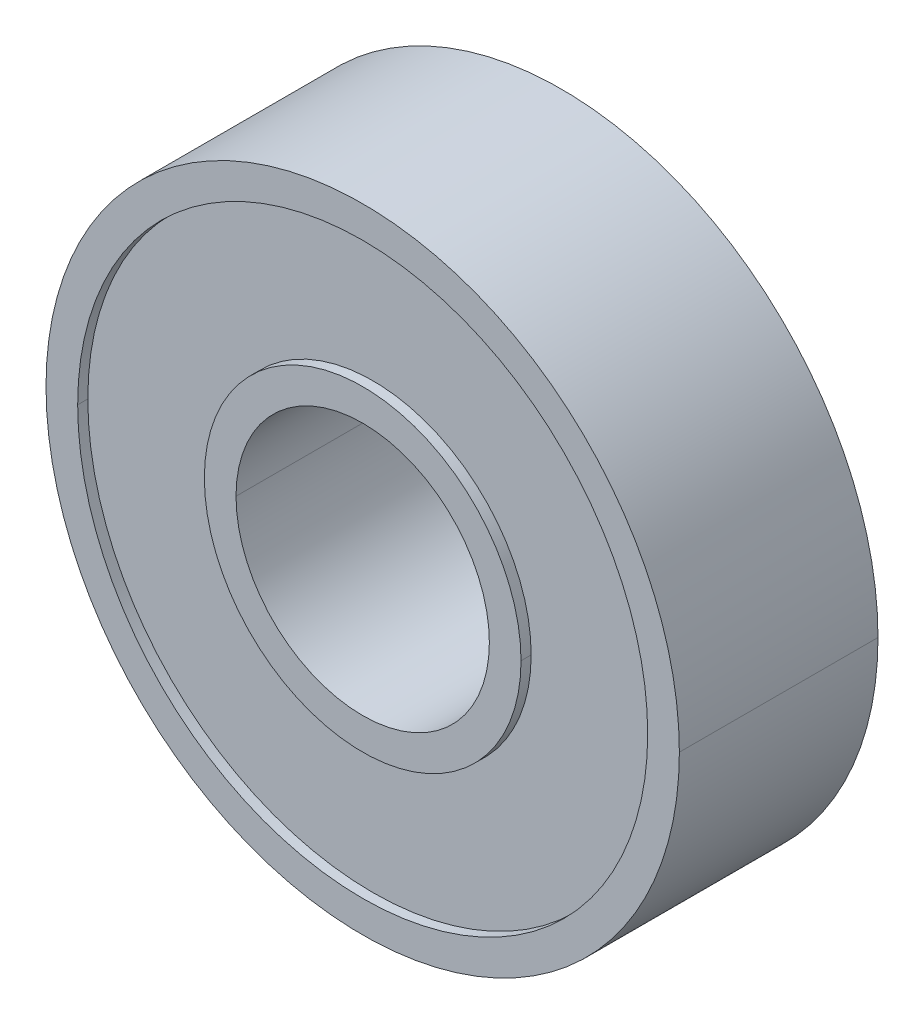
ISO-10303-21;
HEADER;
FILE_DESCRIPTION(('STEP AP214'),'2;1');
FILE_NAME('part.step','',(''),(''),'','','');
FILE_SCHEMA(('AUTOMOTIVE_DESIGN { 1 0 10303 214 1 1 1 1 }'));
ENDSEC;
DATA;
#1=APPLICATION_CONTEXT('core data for automotive mechanical design processes');
#2=APPLICATION_PROTOCOL_DEFINITION('international standard','automotive_design',2000,#1);
#3=PRODUCT_CONTEXT('',#1,'mechanical');
#4=PRODUCT('Part','Part','',(#3));
#5=PRODUCT_RELATED_PRODUCT_CATEGORY('part','',(#4));
#6=PRODUCT_DEFINITION_FORMATION('','',#4);
#7=PRODUCT_DEFINITION_CONTEXT('part definition',#1,'design');
#8=PRODUCT_DEFINITION('design','',#6,#7);
#9=PRODUCT_DEFINITION_SHAPE('','',#8);
#10=(LENGTH_UNIT() NAMED_UNIT(*) SI_UNIT(.MILLI.,.METRE.));
#11=(NAMED_UNIT(*) PLANE_ANGLE_UNIT() SI_UNIT($,.RADIAN.));
#12=(NAMED_UNIT(*) SI_UNIT($,.STERADIAN.) SOLID_ANGLE_UNIT());
#13=UNCERTAINTY_MEASURE_WITH_UNIT(LENGTH_MEASURE(1.E-05),#10,'distance_accuracy_value','');
#14=(GEOMETRIC_REPRESENTATION_CONTEXT(3) GLOBAL_UNCERTAINTY_ASSIGNED_CONTEXT((#13)) GLOBAL_UNIT_ASSIGNED_CONTEXT((#10,
#11,#12)) REPRESENTATION_CONTEXT('',''));
#15=CARTESIAN_POINT('',(0.,0.,0.));
#16=DIRECTION('',(0.,0.,1.));
#17=DIRECTION('',(1.,0.,0.));
#18=AXIS2_PLACEMENT_3D('',#15,#16,#17);
#19=CARTESIAN_POINT('',(0.,0.,-2.4892));
#20=DIRECTION('',(0.,0.,-1.));
#21=DIRECTION('',(-1.,0.,0.));
#22=AXIS2_PLACEMENT_3D('',#19,#20,#21);
#23=CYLINDRICAL_SURFACE('',#22,3.96875);
#24=DIRECTION('',(0.,0.,-1.));
#25=VECTOR('',#24,1.);
#26=CARTESIAN_POINT('',(3.96875,0.,-2.4892));
#27=LINE('',#26,#25);
#28=CARTESIAN_POINT('',(3.96875,0.,-2.2352));
#29=VERTEX_POINT('',#28);
#30=CARTESIAN_POINT('',(3.96875,0.,-2.4892));
#31=VERTEX_POINT('',#30);
#32=EDGE_CURVE('E212',#29,#31,#27,.T.);
#33=ORIENTED_EDGE('',*,*,#32,.F.);
#34=CARTESIAN_POINT('',(0.,0.,-2.2352));
#35=DIRECTION('',(0.,0.,-1.));
#36=DIRECTION('',(-1.,0.,0.));
#37=AXIS2_PLACEMENT_3D('',#34,#35,#36);
#38=CIRCLE('',#37,3.96875);
#39=CARTESIAN_POINT('',(-3.96875,0.,-2.2352));
#40=VERTEX_POINT('',#39);
#41=EDGE_CURVE('E11',#29,#40,#38,.T.);
#42=ORIENTED_EDGE('',*,*,#41,.T.);
#43=DIRECTION('',(0.,0.,-1.));
#44=VECTOR('',#43,1.);
#45=CARTESIAN_POINT('',(-3.96875,0.,-2.4892));
#46=LINE('',#45,#44);
#47=CARTESIAN_POINT('',(-3.96875,0.,-2.4892));
#48=VERTEX_POINT('',#47);
#49=EDGE_CURVE('E188',#40,#48,#46,.T.);
#50=ORIENTED_EDGE('',*,*,#49,.T.);
#51=CARTESIAN_POINT('',(0.,0.,-2.4892));
#52=DIRECTION('',(0.,0.,-1.));
#53=DIRECTION('',(-1.,0.,0.));
#54=AXIS2_PLACEMENT_3D('',#51,#52,#53);
#55=CIRCLE('',#54,3.96875);
#56=EDGE_CURVE('E20',#31,#48,#55,.T.);
#57=ORIENTED_EDGE('',*,*,#56,.F.);
#58=EDGE_LOOP('',(#33,#42,#50,#57));
#59=FACE_BOUND('',#58,.T.);
#60=ADVANCED_FACE('F16',(#59),#23,.T.);
#61=CARTESIAN_POINT('',(7.14375,0.,-2.2352));
#62=DIRECTION('',(0.,0.,1.));
#63=DIRECTION('',(1.,0.,0.));
#64=AXIS2_PLACEMENT_3D('',#61,#62,#63);
#65=PLANE('',#64);
#66=CARTESIAN_POINT('',(0.,0.,-2.2352));
#67=DIRECTION('',(0.,0.,-1.));
#68=DIRECTION('',(-1.,0.,0.));
#69=AXIS2_PLACEMENT_3D('',#66,#67,#68);
#70=CIRCLE('',#69,3.96875);
#71=EDGE_CURVE('E208',#40,#29,#70,.T.);
#72=ORIENTED_EDGE('',*,*,#71,.F.);
#73=ORIENTED_EDGE('',*,*,#41,.F.);
#74=EDGE_LOOP('',(#72,#73));
#75=FACE_BOUND('',#74,.T.);
#76=CARTESIAN_POINT('',(0.,0.,-2.2352));
#77=DIRECTION('',(0.,0.,-1.));
#78=DIRECTION('',(-1.,0.,0.));
#79=AXIS2_PLACEMENT_3D('',#76,#77,#78);
#80=CIRCLE('',#79,7.14375);
#81=CARTESIAN_POINT('',(-7.14375,0.,-2.2352));
#82=VERTEX_POINT('',#81);
#83=CARTESIAN_POINT('',(7.14375,0.,-2.2352));
#84=VERTEX_POINT('',#83);
#85=EDGE_CURVE('E27',#82,#84,#80,.T.);
#86=ORIENTED_EDGE('',*,*,#85,.T.);
#87=CARTESIAN_POINT('',(0.,0.,-2.2352));
#88=DIRECTION('',(0.,0.,-1.));
#89=DIRECTION('',(-1.,0.,0.));
#90=AXIS2_PLACEMENT_3D('',#87,#88,#89);
#91=CIRCLE('',#90,7.14375);
#92=EDGE_CURVE('E183',#84,#82,#91,.T.);
#93=ORIENTED_EDGE('',*,*,#92,.T.);
#94=EDGE_LOOP('',(#86,#93));
#95=FACE_BOUND('',#94,.T.);
#96=ADVANCED_FACE('F290',(#75,#95),#65,.F.);
#97=CARTESIAN_POINT('',(0.,0.,-2.4892));
#98=DIRECTION('',(0.,0.,-1.));
#99=DIRECTION('',(-1.,0.,0.));
#100=AXIS2_PLACEMENT_3D('',#97,#98,#99);
#101=CYLINDRICAL_SURFACE('',#100,7.14375);
#102=DIRECTION('',(0.,0.,-1.));
#103=VECTOR('',#102,1.);
#104=CARTESIAN_POINT('',(7.14375,0.,-2.4892));
#105=LINE('',#104,#103);
#106=CARTESIAN_POINT('',(7.14375,0.,-2.4892));
#107=VERTEX_POINT('',#106);
#108=EDGE_CURVE('E187',#84,#107,#105,.T.);
#109=ORIENTED_EDGE('',*,*,#108,.F.);
#110=ORIENTED_EDGE('',*,*,#85,.F.);
#111=DIRECTION('',(0.,0.,-1.));
#112=VECTOR('',#111,1.);
#113=CARTESIAN_POINT('',(-7.14375,0.,-2.4892));
#114=LINE('',#113,#112);
#115=CARTESIAN_POINT('',(-7.14375,0.,-2.4892));
#116=VERTEX_POINT('',#115);
#117=EDGE_CURVE('E201',#82,#116,#114,.T.);
#118=ORIENTED_EDGE('',*,*,#117,.T.);
#119=CARTESIAN_POINT('',(0.,0.,-2.4892));
#120=DIRECTION('',(0.,0.,-1.));
#121=DIRECTION('',(-1.,0.,0.));
#122=AXIS2_PLACEMENT_3D('',#119,#120,#121);
#123=CIRCLE('',#122,7.14375);
#124=EDGE_CURVE('E176',#116,#107,#123,.T.);
#125=ORIENTED_EDGE('',*,*,#124,.T.);
#126=EDGE_LOOP('',(#109,#110,#118,#125));
#127=FACE_BOUND('',#126,.T.);
#128=ADVANCED_FACE('F279',(#127),#101,.F.);
#129=CARTESIAN_POINT('',(7.9375,0.,-2.4892));
#130=DIRECTION('',(0.,0.,1.));
#131=DIRECTION('',(1.,0.,0.));
#132=AXIS2_PLACEMENT_3D('',#129,#130,#131);
#133=PLANE('',#132);
#134=ORIENTED_EDGE('',*,*,#124,.F.);
#135=CARTESIAN_POINT('',(0.,0.,-2.4892));
#136=DIRECTION('',(0.,0.,-1.));
#137=DIRECTION('',(-1.,0.,0.));
#138=AXIS2_PLACEMENT_3D('',#135,#136,#137);
#139=CIRCLE('',#138,7.14375);
#140=EDGE_CURVE('E235',#107,#116,#139,.T.);
#141=ORIENTED_EDGE('',*,*,#140,.F.);
#142=EDGE_LOOP('',(#134,#141));
#143=FACE_BOUND('',#142,.T.);
#144=CARTESIAN_POINT('',(0.,0.,-2.4892));
#145=DIRECTION('',(0.,0.,-1.));
#146=DIRECTION('',(-1.,0.,0.));
#147=AXIS2_PLACEMENT_3D('',#144,#145,#146);
#148=CIRCLE('',#147,7.9375);
#149=CARTESIAN_POINT('',(-7.9375,0.,-2.4892));
#150=VERTEX_POINT('',#149);
#151=CARTESIAN_POINT('',(7.9375,0.,-2.4892));
#152=VERTEX_POINT('',#151);
#153=EDGE_CURVE('E202',#150,#152,#148,.T.);
#154=ORIENTED_EDGE('',*,*,#153,.T.);
#155=CARTESIAN_POINT('',(0.,0.,-2.4892));
#156=DIRECTION('',(0.,0.,-1.));
#157=DIRECTION('',(-1.,0.,0.));
#158=AXIS2_PLACEMENT_3D('',#155,#156,#157);
#159=CIRCLE('',#158,7.9375);
#160=EDGE_CURVE('E80',#152,#150,#159,.T.);
#161=ORIENTED_EDGE('',*,*,#160,.T.);
#162=EDGE_LOOP('',(#154,#161));
#163=FACE_BOUND('',#162,.T.);
#164=ADVANCED_FACE('F286',(#143,#163),#133,.F.);
#165=CARTESIAN_POINT('',(0.,0.,-2.4892));
#166=DIRECTION('',(0.,0.,-1.));
#167=DIRECTION('',(-1.,0.,0.));
#168=AXIS2_PLACEMENT_3D('',#165,#166,#167);
#169=CYLINDRICAL_SURFACE('',#168,7.9375);
#170=DIRECTION('',(0.,0.,-1.));
#171=VECTOR('',#170,1.);
#172=CARTESIAN_POINT('',(7.9375,0.,-2.4892));
#173=LINE('',#172,#171);
#174=CARTESIAN_POINT('',(7.9375,0.,2.4892));
#175=VERTEX_POINT('',#174);
#176=EDGE_CURVE('E200',#175,#152,#173,.T.);
#177=ORIENTED_EDGE('',*,*,#176,.F.);
#178=CARTESIAN_POINT('',(0.,0.,2.4892));
#179=DIRECTION('',(0.,0.,-1.));
#180=DIRECTION('',(-1.,0.,0.));
#181=AXIS2_PLACEMENT_3D('',#178,#179,#180);
#182=CIRCLE('',#181,7.9375);
#183=CARTESIAN_POINT('',(-7.9375,0.,2.4892));
#184=VERTEX_POINT('',#183);
#185=EDGE_CURVE('E67',#175,#184,#182,.T.);
#186=ORIENTED_EDGE('',*,*,#185,.T.);
#187=DIRECTION('',(0.,0.,-1.));
#188=VECTOR('',#187,1.);
#189=CARTESIAN_POINT('',(-7.9375,0.,-2.4892));
#190=LINE('',#189,#188);
#191=EDGE_CURVE('E191',#184,#150,#190,.T.);
#192=ORIENTED_EDGE('',*,*,#191,.T.);
#193=ORIENTED_EDGE('',*,*,#160,.F.);
#194=EDGE_LOOP('',(#177,#186,#192,#193));
#195=FACE_BOUND('',#194,.T.);
#196=ADVANCED_FACE('F663',(#195),#169,.T.);
#197=CARTESIAN_POINT('',(7.14375,0.,2.4892));
#198=DIRECTION('',(0.,0.,-1.));
#199=DIRECTION('',(-1.,0.,0.));
#200=AXIS2_PLACEMENT_3D('',#197,#198,#199);
#201=PLANE('',#200);
#202=CARTESIAN_POINT('',(0.,0.,2.4892));
#203=DIRECTION('',(0.,0.,-1.));
#204=DIRECTION('',(-1.,0.,0.));
#205=AXIS2_PLACEMENT_3D('',#202,#203,#204);
#206=CIRCLE('',#205,7.14375);
#207=CARTESIAN_POINT('',(-7.14375,0.,2.4892));
#208=VERTEX_POINT('',#207);
#209=CARTESIAN_POINT('',(7.14375,0.,2.4892));
#210=VERTEX_POINT('',#209);
#211=EDGE_CURVE('E145',#208,#210,#206,.T.);
#212=ORIENTED_EDGE('',*,*,#211,.T.);
#213=CARTESIAN_POINT('',(0.,0.,2.4892));
#214=DIRECTION('',(0.,0.,-1.));
#215=DIRECTION('',(-1.,0.,0.));
#216=AXIS2_PLACEMENT_3D('',#213,#214,#215);
#217=CIRCLE('',#216,7.14375);
#218=EDGE_CURVE('E165',#210,#208,#217,.T.);
#219=ORIENTED_EDGE('',*,*,#218,.T.);
#220=EDGE_LOOP('',(#212,#219));
#221=FACE_BOUND('',#220,.T.);
#222=CARTESIAN_POINT('',(0.,0.,2.4892));
#223=DIRECTION('',(0.,0.,-1.));
#224=DIRECTION('',(-1.,0.,0.));
#225=AXIS2_PLACEMENT_3D('',#222,#223,#224);
#226=CIRCLE('',#225,7.9375);
#227=EDGE_CURVE('E196',#184,#175,#226,.T.);
#228=ORIENTED_EDGE('',*,*,#227,.F.);
#229=ORIENTED_EDGE('',*,*,#185,.F.);
#230=EDGE_LOOP('',(#228,#229));
#231=FACE_BOUND('',#230,.T.);
#232=ADVANCED_FACE('F610',(#221,#231),#201,.F.);
#233=CARTESIAN_POINT('',(0.,0.,-2.4892));
#234=DIRECTION('',(0.,0.,-1.));
#235=DIRECTION('',(-1.,0.,0.));
#236=AXIS2_PLACEMENT_3D('',#233,#234,#235);
#237=CYLINDRICAL_SURFACE('',#236,7.14375);
#238=DIRECTION('',(0.,0.,-1.));
#239=VECTOR('',#238,1.);
#240=CARTESIAN_POINT('',(7.14375,0.,-2.4892));
#241=LINE('',#240,#239);
#242=CARTESIAN_POINT('',(7.14375,0.,2.2352));
#243=VERTEX_POINT('',#242);
#244=EDGE_CURVE('E158',#210,#243,#241,.T.);
#245=ORIENTED_EDGE('',*,*,#244,.F.);
#246=ORIENTED_EDGE('',*,*,#211,.F.);
#247=DIRECTION('',(0.,0.,-1.));
#248=VECTOR('',#247,1.);
#249=CARTESIAN_POINT('',(-7.14375,0.,-2.4892));
#250=LINE('',#249,#248);
#251=CARTESIAN_POINT('',(-7.14375,0.,2.2352));
#252=VERTEX_POINT('',#251);
#253=EDGE_CURVE('E149',#208,#252,#250,.T.);
#254=ORIENTED_EDGE('',*,*,#253,.T.);
#255=CARTESIAN_POINT('',(0.,0.,2.2352));
#256=DIRECTION('',(0.,0.,-1.));
#257=DIRECTION('',(-1.,0.,0.));
#258=AXIS2_PLACEMENT_3D('',#255,#256,#257);
#259=CIRCLE('',#258,7.14375);
#260=EDGE_CURVE('E136',#252,#243,#259,.T.);
#261=ORIENTED_EDGE('',*,*,#260,.T.);
#262=EDGE_LOOP('',(#245,#246,#254,#261));
#263=FACE_BOUND('',#262,.T.);
#264=ADVANCED_FACE('F150',(#263),#237,.F.);
#265=CARTESIAN_POINT('',(3.96875,0.,2.2352));
#266=DIRECTION('',(0.,0.,-1.));
#267=DIRECTION('',(-1.,0.,0.));
#268=AXIS2_PLACEMENT_3D('',#265,#266,#267);
#269=PLANE('',#268);
#270=CARTESIAN_POINT('',(0.,0.,2.2352));
#271=DIRECTION('',(0.,0.,-1.));
#272=DIRECTION('',(-1.,0.,0.));
#273=AXIS2_PLACEMENT_3D('',#270,#271,#272);
#274=CIRCLE('',#273,3.96875);
#275=CARTESIAN_POINT('',(-3.96875,0.,2.2352));
#276=VERTEX_POINT('',#275);
#277=CARTESIAN_POINT('',(3.96875,0.,2.2352));
#278=VERTEX_POINT('',#277);
#279=EDGE_CURVE('E182',#276,#278,#274,.T.);
#280=ORIENTED_EDGE('',*,*,#279,.T.);
#281=CARTESIAN_POINT('',(0.,0.,2.2352));
#282=DIRECTION('',(0.,0.,-1.));
#283=DIRECTION('',(-1.,0.,0.));
#284=AXIS2_PLACEMENT_3D('',#281,#282,#283);
#285=CIRCLE('',#284,3.96875);
#286=EDGE_CURVE('E146',#278,#276,#285,.T.);
#287=ORIENTED_EDGE('',*,*,#286,.T.);
#288=EDGE_LOOP('',(#280,#287));
#289=FACE_BOUND('',#288,.T.);
#290=ORIENTED_EDGE('',*,*,#260,.F.);
#291=CARTESIAN_POINT('',(0.,0.,2.2352));
#292=DIRECTION('',(0.,0.,-1.));
#293=DIRECTION('',(-1.,0.,0.));
#294=AXIS2_PLACEMENT_3D('',#291,#292,#293);
#295=CIRCLE('',#294,7.14375);
#296=EDGE_CURVE('E140',#243,#252,#295,.T.);
#297=ORIENTED_EDGE('',*,*,#296,.F.);
#298=EDGE_LOOP('',(#290,#297));
#299=FACE_BOUND('',#298,.T.);
#300=ADVANCED_FACE('F138',(#289,#299),#269,.F.);
#301=CARTESIAN_POINT('',(0.,0.,-2.4892));
#302=DIRECTION('',(0.,0.,-1.));
#303=DIRECTION('',(-1.,0.,0.));
#304=AXIS2_PLACEMENT_3D('',#301,#302,#303);
#305=CYLINDRICAL_SURFACE('',#304,3.96875);
#306=DIRECTION('',(0.,0.,-1.));
#307=VECTOR('',#306,1.);
#308=CARTESIAN_POINT('',(3.96875,0.,-2.4892));
#309=LINE('',#308,#307);
#310=CARTESIAN_POINT('',(3.96875,0.,2.4892));
#311=VERTEX_POINT('',#310);
#312=EDGE_CURVE('E195',#311,#278,#309,.T.);
#313=ORIENTED_EDGE('',*,*,#312,.F.);
#314=CARTESIAN_POINT('',(0.,0.,2.4892));
#315=DIRECTION('',(0.,0.,-1.));
#316=DIRECTION('',(-1.,0.,0.));
#317=AXIS2_PLACEMENT_3D('',#314,#315,#316);
#318=CIRCLE('',#317,3.96875);
#319=CARTESIAN_POINT('',(-3.96875,0.,2.4892));
#320=VERTEX_POINT('',#319);
#321=EDGE_CURVE('E224',#311,#320,#318,.T.);
#322=ORIENTED_EDGE('',*,*,#321,.T.);
#323=DIRECTION('',(0.,0.,-1.));
#324=VECTOR('',#323,1.);
#325=CARTESIAN_POINT('',(-3.96875,0.,-2.4892));
#326=LINE('',#325,#324);
#327=EDGE_CURVE('E178',#320,#276,#326,.T.);
#328=ORIENTED_EDGE('',*,*,#327,.T.);
#329=ORIENTED_EDGE('',*,*,#286,.F.);
#330=EDGE_LOOP('',(#313,#322,#328,#329));
#331=FACE_BOUND('',#330,.T.);
#332=ADVANCED_FACE('F345',(#331),#305,.T.);
#333=CARTESIAN_POINT('',(3.175,0.,2.4892));
#334=DIRECTION('',(0.,0.,-1.));
#335=DIRECTION('',(-1.,0.,0.));
#336=AXIS2_PLACEMENT_3D('',#333,#334,#335);
#337=PLANE('',#336);
#338=CARTESIAN_POINT('',(0.,0.,2.4892));
#339=DIRECTION('',(0.,0.,-1.));
#340=DIRECTION('',(-1.,0.,0.));
#341=AXIS2_PLACEMENT_3D('',#338,#339,#340);
#342=CIRCLE('',#341,3.175);
#343=CARTESIAN_POINT('',(-3.175,0.,2.4892));
#344=VERTEX_POINT('',#343);
#345=CARTESIAN_POINT('',(3.175,0.,2.4892));
#346=VERTEX_POINT('',#345);
#347=EDGE_CURVE('E207',#344,#346,#342,.T.);
#348=ORIENTED_EDGE('',*,*,#347,.T.);
#349=CARTESIAN_POINT('',(0.,0.,2.4892));
#350=DIRECTION('',(0.,0.,-1.));
#351=DIRECTION('',(-1.,0.,0.));
#352=AXIS2_PLACEMENT_3D('',#349,#350,#351);
#353=CIRCLE('',#352,3.175);
#354=EDGE_CURVE('E174',#346,#344,#353,.T.);
#355=ORIENTED_EDGE('',*,*,#354,.T.);
#356=EDGE_LOOP('',(#348,#355));
#357=FACE_BOUND('',#356,.T.);
#358=CARTESIAN_POINT('',(0.,0.,2.4892));
#359=DIRECTION('',(0.,0.,-1.));
#360=DIRECTION('',(-1.,0.,0.));
#361=AXIS2_PLACEMENT_3D('',#358,#359,#360);
#362=CIRCLE('',#361,3.96875);
#363=EDGE_CURVE('E155',#320,#311,#362,.T.);
#364=ORIENTED_EDGE('',*,*,#363,.F.);
#365=ORIENTED_EDGE('',*,*,#321,.F.);
#366=EDGE_LOOP('',(#364,#365));
#367=FACE_BOUND('',#366,.T.);
#368=ADVANCED_FACE('F362',(#357,#367),#337,.F.);
#369=CARTESIAN_POINT('',(0.,0.,-2.4892));
#370=DIRECTION('',(0.,0.,-1.));
#371=DIRECTION('',(-1.,0.,0.));
#372=AXIS2_PLACEMENT_3D('',#369,#370,#371);
#373=CYLINDRICAL_SURFACE('',#372,3.175);
#374=DIRECTION('',(0.,0.,-1.));
#375=VECTOR('',#374,1.);
#376=CARTESIAN_POINT('',(3.175,0.,-2.4892));
#377=LINE('',#376,#375);
#378=CARTESIAN_POINT('',(3.175,0.,-2.4892));
#379=VERTEX_POINT('',#378);
#380=EDGE_CURVE('E169',#346,#379,#377,.T.);
#381=ORIENTED_EDGE('',*,*,#380,.F.);
#382=ORIENTED_EDGE('',*,*,#347,.F.);
#383=DIRECTION('',(0.,0.,-1.));
#384=VECTOR('',#383,1.);
#385=CARTESIAN_POINT('',(-3.175,0.,-2.4892));
#386=LINE('',#385,#384);
#387=CARTESIAN_POINT('',(-3.175,0.,-2.4892));
#388=VERTEX_POINT('',#387);
#389=EDGE_CURVE('E221',#344,#388,#386,.T.);
#390=ORIENTED_EDGE('',*,*,#389,.T.);
#391=CARTESIAN_POINT('',(0.,0.,-2.4892));
#392=DIRECTION('',(0.,0.,-1.));
#393=DIRECTION('',(-1.,0.,0.));
#394=AXIS2_PLACEMENT_3D('',#391,#392,#393);
#395=CIRCLE('',#394,3.175);
#396=EDGE_CURVE('E41',#388,#379,#395,.T.);
#397=ORIENTED_EDGE('',*,*,#396,.T.);
#398=EDGE_LOOP('',(#381,#382,#390,#397));
#399=FACE_BOUND('',#398,.T.);
#400=ADVANCED_FACE('F370',(#399),#373,.F.);
#401=CARTESIAN_POINT('',(3.96875,0.,-2.4892));
#402=DIRECTION('',(0.,0.,1.));
#403=DIRECTION('',(1.,0.,0.));
#404=AXIS2_PLACEMENT_3D('',#401,#402,#403);
#405=PLANE('',#404);
#406=ORIENTED_EDGE('',*,*,#396,.F.);
#407=CARTESIAN_POINT('',(0.,0.,-2.4892));
#408=DIRECTION('',(0.,0.,-1.));
#409=DIRECTION('',(-1.,0.,0.));
#410=AXIS2_PLACEMENT_3D('',#407,#408,#409);
#411=CIRCLE('',#410,3.175);
#412=EDGE_CURVE('E173',#379,#388,#411,.T.);
#413=ORIENTED_EDGE('',*,*,#412,.F.);
#414=EDGE_LOOP('',(#406,#413));
#415=FACE_BOUND('',#414,.T.);
#416=CARTESIAN_POINT('',(0.,0.,-2.4892));
#417=DIRECTION('',(0.,0.,-1.));
#418=DIRECTION('',(-1.,0.,0.));
#419=AXIS2_PLACEMENT_3D('',#416,#417,#418);
#420=CIRCLE('',#419,3.96875);
#421=EDGE_CURVE('E245',#48,#31,#420,.T.);
#422=ORIENTED_EDGE('',*,*,#421,.T.);
#423=ORIENTED_EDGE('',*,*,#56,.T.);
#424=EDGE_LOOP('',(#422,#423));
#425=FACE_BOUND('',#424,.T.);
#426=ADVANCED_FACE('F378',(#415,#425),#405,.F.);
#427=CARTESIAN_POINT('',(0.,0.,-2.4892));
#428=DIRECTION('',(0.,0.,-1.));
#429=DIRECTION('',(-1.,0.,0.));
#430=AXIS2_PLACEMENT_3D('',#427,#428,#429);
#431=CYLINDRICAL_SURFACE('',#430,3.175);
#432=ORIENTED_EDGE('',*,*,#354,.F.);
#433=ORIENTED_EDGE('',*,*,#380,.T.);
#434=ORIENTED_EDGE('',*,*,#412,.T.);
#435=ORIENTED_EDGE('',*,*,#389,.F.);
#436=EDGE_LOOP('',(#432,#433,#434,#435));
#437=FACE_BOUND('',#436,.T.);
#438=ADVANCED_FACE('F387',(#437),#431,.F.);
#439=CARTESIAN_POINT('',(0.,0.,-2.4892));
#440=DIRECTION('',(0.,0.,-1.));
#441=DIRECTION('',(-1.,0.,0.));
#442=AXIS2_PLACEMENT_3D('',#439,#440,#441);
#443=CYLINDRICAL_SURFACE('',#442,3.96875);
#444=ORIENTED_EDGE('',*,*,#363,.T.);
#445=ORIENTED_EDGE('',*,*,#312,.T.);
#446=ORIENTED_EDGE('',*,*,#279,.F.);
#447=ORIENTED_EDGE('',*,*,#327,.F.);
#448=EDGE_LOOP('',(#444,#445,#446,#447));
#449=FACE_BOUND('',#448,.T.);
#450=ADVANCED_FACE('F395',(#449),#443,.T.);
#451=CARTESIAN_POINT('',(0.,0.,-2.4892));
#452=DIRECTION('',(0.,0.,-1.));
#453=DIRECTION('',(-1.,0.,0.));
#454=AXIS2_PLACEMENT_3D('',#451,#452,#453);
#455=CYLINDRICAL_SURFACE('',#454,7.14375);
#456=ORIENTED_EDGE('',*,*,#218,.F.);
#457=ORIENTED_EDGE('',*,*,#244,.T.);
#458=ORIENTED_EDGE('',*,*,#296,.T.);
#459=ORIENTED_EDGE('',*,*,#253,.F.);
#460=EDGE_LOOP('',(#456,#457,#458,#459));
#461=FACE_BOUND('',#460,.T.);
#462=ADVANCED_FACE('F157',(#461),#455,.F.);
#463=CARTESIAN_POINT('',(0.,0.,-2.4892));
#464=DIRECTION('',(0.,0.,-1.));
#465=DIRECTION('',(-1.,0.,0.));
#466=AXIS2_PLACEMENT_3D('',#463,#464,#465);
#467=CYLINDRICAL_SURFACE('',#466,7.9375);
#468=ORIENTED_EDGE('',*,*,#227,.T.);
#469=ORIENTED_EDGE('',*,*,#176,.T.);
#470=ORIENTED_EDGE('',*,*,#153,.F.);
#471=ORIENTED_EDGE('',*,*,#191,.F.);
#472=EDGE_LOOP('',(#468,#469,#470,#471));
#473=FACE_BOUND('',#472,.T.);
#474=ADVANCED_FACE('F412',(#473),#467,.T.);
#475=CARTESIAN_POINT('',(0.,0.,-2.4892));
#476=DIRECTION('',(0.,0.,-1.));
#477=DIRECTION('',(-1.,0.,0.));
#478=AXIS2_PLACEMENT_3D('',#475,#476,#477);
#479=CYLINDRICAL_SURFACE('',#478,7.14375);
#480=ORIENTED_EDGE('',*,*,#92,.F.);
#481=ORIENTED_EDGE('',*,*,#108,.T.);
#482=ORIENTED_EDGE('',*,*,#140,.T.);
#483=ORIENTED_EDGE('',*,*,#117,.F.);
#484=EDGE_LOOP('',(#480,#481,#482,#483));
#485=FACE_BOUND('',#484,.T.);
#486=ADVANCED_FACE('F18',(#485),#479,.F.);
#487=CARTESIAN_POINT('',(0.,0.,-2.4892));
#488=DIRECTION('',(0.,0.,-1.));
#489=DIRECTION('',(-1.,0.,0.));
#490=AXIS2_PLACEMENT_3D('',#487,#488,#489);
#491=CYLINDRICAL_SURFACE('',#490,3.96875);
#492=ORIENTED_EDGE('',*,*,#71,.T.);
#493=ORIENTED_EDGE('',*,*,#32,.T.);
#494=ORIENTED_EDGE('',*,*,#421,.F.);
#495=ORIENTED_EDGE('',*,*,#49,.F.);
#496=EDGE_LOOP('',(#492,#493,#494,#495));
#497=FACE_BOUND('',#496,.T.);
#498=ADVANCED_FACE('F428',(#497),#491,.T.);
#499=CLOSED_SHELL('',(#60,#96,#128,#164,#196,#232,#264,#300,#332,#368,#400,#426,#438,#450,#462,
#474,#486,#498));
#500=MANIFOLD_SOLID_BREP('B1',#499);
#501=ADVANCED_BREP_SHAPE_REPRESENTATION('',(#18,#500),#14);
#502=SHAPE_DEFINITION_REPRESENTATION(#9,#501);
ENDSEC;
END-ISO-10303-21;
